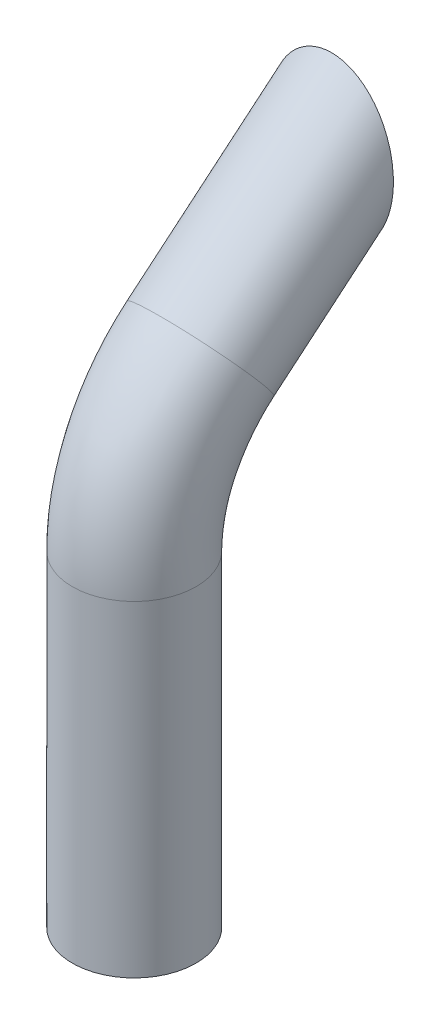
ISO-10303-21;
HEADER;
FILE_DESCRIPTION(('STEP AP214'),'2;1');
FILE_NAME('part.step','',(''),(''),'','','');
FILE_SCHEMA(('AUTOMOTIVE_DESIGN { 1 0 10303 214 1 1 1 1 }'));
ENDSEC;
DATA;
#1=APPLICATION_CONTEXT('core data for automotive mechanical design processes');
#2=APPLICATION_PROTOCOL_DEFINITION('international standard','automotive_design',2000,#1);
#3=PRODUCT_CONTEXT('',#1,'mechanical');
#4=PRODUCT('Part','Part','',(#3));
#5=PRODUCT_RELATED_PRODUCT_CATEGORY('part','',(#4));
#6=PRODUCT_DEFINITION_FORMATION('','',#4);
#7=PRODUCT_DEFINITION_CONTEXT('part definition',#1,'design');
#8=PRODUCT_DEFINITION('design','',#6,#7);
#9=PRODUCT_DEFINITION_SHAPE('','',#8);
#10=(LENGTH_UNIT() NAMED_UNIT(*) SI_UNIT(.MILLI.,.METRE.));
#11=(NAMED_UNIT(*) PLANE_ANGLE_UNIT() SI_UNIT($,.RADIAN.));
#12=(NAMED_UNIT(*) SI_UNIT($,.STERADIAN.) SOLID_ANGLE_UNIT());
#13=UNCERTAINTY_MEASURE_WITH_UNIT(LENGTH_MEASURE(1.E-05),#10,'distance_accuracy_value','');
#14=(GEOMETRIC_REPRESENTATION_CONTEXT(3) GLOBAL_UNCERTAINTY_ASSIGNED_CONTEXT((#13)) GLOBAL_UNIT_ASSIGNED_CONTEXT((#10,
#11,#12)) REPRESENTATION_CONTEXT('',''));
#15=CARTESIAN_POINT('',(0.,0.,0.));
#16=DIRECTION('',(0.,0.,1.));
#17=DIRECTION('',(1.,0.,0.));
#18=AXIS2_PLACEMENT_3D('',#15,#16,#17);
#19=CARTESIAN_POINT('',(0.,-296.418141452981,114.906666467847));
#20=DIRECTION('',(0.,-1.,0.));
#21=DIRECTION('',(0.,0.,-1.));
#22=AXIS2_PLACEMENT_3D('',#19,#20,#21);
#23=PLANE('',#22);
#24=CARTESIAN_POINT('',(0.,-296.418141452981,114.906666467847));
#25=DIRECTION('',(0.,-1.,0.));
#26=DIRECTION('',(0.,0.,-1.));
#27=AXIS2_PLACEMENT_3D('',#24,#25,#26);
#28=CIRCLE('',#27,27.);
#29=CARTESIAN_POINT('',(0.,-296.418141452981,87.9066664678469));
#30=VERTEX_POINT('',#29);
#31=EDGE_CURVE('E56',#30,#30,#28,.T.);
#32=ORIENTED_EDGE('',*,*,#31,.F.);
#33=EDGE_LOOP('',(#32));
#34=FACE_BOUND('',#33,.T.);
#35=CARTESIAN_POINT('',(0.,-296.418141452981,114.906666467847));
#36=DIRECTION('',(0.,-1.,0.));
#37=DIRECTION('',(0.,0.,-1.));
#38=AXIS2_PLACEMENT_3D('',#35,#36,#37);
#39=CIRCLE('',#38,30.);
#40=CARTESIAN_POINT('',(0.,-296.418141452981,84.9066664678469));
#41=VERTEX_POINT('',#40);
#42=EDGE_CURVE('E10',#41,#41,#39,.T.);
#43=ORIENTED_EDGE('',*,*,#42,.T.);
#44=EDGE_LOOP('',(#43));
#45=FACE_BOUND('',#44,.T.);
#46=ADVANCED_FACE('F37',(#34,#45),#23,.T.);
#47=CARTESIAN_POINT('',(0.,0.,0.));
#48=DIRECTION('',(0.,-0.642787609686538,0.766044443118979));
#49=DIRECTION('',(0.,-0.766044443118979,-0.642787609686538));
#50=AXIS2_PLACEMENT_3D('',#47,#48,#49);
#51=CYLINDRICAL_SURFACE('',#50,30.);
#52=CARTESIAN_POINT('',(0.,-16.1808853863989,19.2836282905961));
#53=DIRECTION('',(0.,0.,1.));
#54=DIRECTION('',(0.,-1.,0.));
#55=AXIS2_PLACEMENT_3D('',#52,#53,#54);
#56=ELLIPSE('',#55,39.1622186799683,30.);
#57=CARTESIAN_POINT('',(0.,-55.3431040663672,19.2836282905961));
#58=VERTEX_POINT('',#57);
#59=EDGE_CURVE('E68',#58,#58,#56,.F.);
#60=ORIENTED_EDGE('',*,*,#59,.F.);
#61=EDGE_LOOP('',(#60));
#62=FACE_BOUND('',#61,.T.);
#63=CARTESIAN_POINT('',(0.,-69.4418308062223,82.757551339635));
#64=DIRECTION('',(0.,-0.642787609686538,0.766044443118979));
#65=DIRECTION('',(0.,-0.766044443118979,-0.642787609686538));
#66=AXIS2_PLACEMENT_3D('',#63,#64,#65);
#67=CIRCLE('',#66,30.);
#68=CARTESIAN_POINT('',(0.,-46.4604975126529,102.041179630231));
#69=VERTEX_POINT('',#68);
#70=EDGE_CURVE('E50',#69,#69,#67,.T.);
#71=ORIENTED_EDGE('',*,*,#70,.F.);
#72=EDGE_LOOP('',(#71));
#73=FACE_BOUND('',#72,.T.);
#74=ADVANCED_FACE('F99',(#62,#73),#51,.T.);
#75=CARTESIAN_POINT('',(0.,-138.385830686931,24.9066664678469));
#76=DIRECTION('',(1.,0.,0.));
#77=DIRECTION('',(0.,0.,-1.));
#78=AXIS2_PLACEMENT_3D('',#75,#76,#77);
#79=TOROIDAL_SURFACE('',#78,90.,30.);
#80=CARTESIAN_POINT('',(0.,-138.385830686931,114.906666467847));
#81=DIRECTION('',(0.,-1.,0.));
#82=DIRECTION('',(0.,0.,-1.));
#83=AXIS2_PLACEMENT_3D('',#80,#81,#82);
#84=CIRCLE('',#83,30.);
#85=CARTESIAN_POINT('',(0.,-138.385830686931,144.906666467847));
#86=VERTEX_POINT('',#85);
#87=EDGE_CURVE('E45',#86,#86,#84,.T.);
#88=CARTESIAN_POINT('',(0.,-138.385830686931,24.9066664678469));
#89=DIRECTION('',(1.,0.,0.));
#90=DIRECTION('',(0.,0.,-1.));
#91=AXIS2_PLACEMENT_3D('',#88,#89,#90);
#92=CIRCLE('',#91,120.);
#93=EDGE_CURVE('',#69,#86,#92,.T.);
#94=ORIENTED_EDGE('',*,*,#70,.T.);
#95=ORIENTED_EDGE('',*,*,#87,.F.);
#96=ORIENTED_EDGE('',*,*,#93,.T.);
#97=ORIENTED_EDGE('',*,*,#93,.F.);
#98=EDGE_LOOP('',(#94,#96,#95,#97));
#99=FACE_BOUND('',#98,.T.);
#100=ADVANCED_FACE('F94',(#99),#79,.T.);
#101=CARTESIAN_POINT('',(0.,-138.385830686931,114.906666467847));
#102=DIRECTION('',(0.,-1.,0.));
#103=DIRECTION('',(0.,0.,-1.));
#104=AXIS2_PLACEMENT_3D('',#101,#102,#103);
#105=CYLINDRICAL_SURFACE('',#104,30.);
#106=ORIENTED_EDGE('',*,*,#42,.F.);
#107=EDGE_LOOP('',(#106));
#108=FACE_BOUND('',#107,.T.);
#109=ORIENTED_EDGE('',*,*,#87,.T.);
#110=EDGE_LOOP('',(#109));
#111=FACE_BOUND('',#110,.T.);
#112=ADVANCED_FACE('F92',(#108,#111),#105,.T.);
#113=CARTESIAN_POINT('',(0.,0.,0.));
#114=DIRECTION('',(0.,-0.642787609686538,0.766044443118979));
#115=DIRECTION('',(0.,-0.766044443118979,-0.642787609686538));
#116=AXIS2_PLACEMENT_3D('',#113,#114,#115);
#117=CYLINDRICAL_SURFACE('',#116,27.);
#118=CARTESIAN_POINT('',(0.,-16.1808853863989,19.2836282905961));
#119=DIRECTION('',(0.,0.,1.));
#120=DIRECTION('',(0.,-1.,0.));
#121=AXIS2_PLACEMENT_3D('',#118,#119,#120);
#122=ELLIPSE('',#121,35.2459968119715,27.);
#123=CARTESIAN_POINT('',(0.,-51.4268821983704,19.2836282905961));
#124=VERTEX_POINT('',#123);
#125=EDGE_CURVE('E40',#124,#124,#122,.F.);
#126=ORIENTED_EDGE('',*,*,#125,.T.);
#127=EDGE_LOOP('',(#126));
#128=FACE_BOUND('',#127,.T.);
#129=CARTESIAN_POINT('',(0.,-69.4418308062224,82.7575513396351));
#130=DIRECTION('',(0.,0.642787609686536,-0.766044443118981));
#131=DIRECTION('',(0.,0.766044443118981,0.642787609686536));
#132=AXIS2_PLACEMENT_3D('',#129,#130,#131);
#133=CIRCLE('',#132,27.);
#134=CARTESIAN_POINT('',(0.,-48.7586308420099,100.112816801172));
#135=VERTEX_POINT('',#134);
#136=EDGE_CURVE('E64',#135,#135,#133,.F.);
#137=ORIENTED_EDGE('',*,*,#136,.T.);
#138=EDGE_LOOP('',(#137));
#139=FACE_BOUND('',#138,.T.);
#140=ADVANCED_FACE('F77',(#128,#139),#117,.F.);
#141=CARTESIAN_POINT('',(0.,-138.385830686931,24.9066664678469));
#142=DIRECTION('',(1.,0.,0.));
#143=DIRECTION('',(0.,0.,-1.));
#144=AXIS2_PLACEMENT_3D('',#141,#142,#143);
#145=TOROIDAL_SURFACE('',#144,90.,27.);
#146=CARTESIAN_POINT('',(0.,-138.385830686931,114.906666467847));
#147=DIRECTION('',(0.,-1.,0.));
#148=DIRECTION('',(0.,0.,-1.));
#149=AXIS2_PLACEMENT_3D('',#146,#147,#148);
#150=CIRCLE('',#149,27.);
#151=CARTESIAN_POINT('',(0.,-138.385830686931,141.906666467847));
#152=VERTEX_POINT('',#151);
#153=EDGE_CURVE('E60',#152,#152,#150,.T.);
#154=CARTESIAN_POINT('',(0.,-138.385830686931,24.9066664678469));
#155=DIRECTION('',(1.,0.,0.));
#156=DIRECTION('',(0.,0.,-1.));
#157=AXIS2_PLACEMENT_3D('',#154,#155,#156);
#158=CIRCLE('',#157,117.);
#159=EDGE_CURVE('',#135,#152,#158,.T.);
#160=ORIENTED_EDGE('',*,*,#136,.F.);
#161=ORIENTED_EDGE('',*,*,#153,.T.);
#162=ORIENTED_EDGE('',*,*,#159,.T.);
#163=ORIENTED_EDGE('',*,*,#159,.F.);
#164=EDGE_LOOP('',(#160,#162,#161,#163));
#165=FACE_BOUND('',#164,.T.);
#166=ADVANCED_FACE('F87',(#165),#145,.F.);
#167=CARTESIAN_POINT('',(0.,-138.385830686931,114.906666467847));
#168=DIRECTION('',(0.,-1.,0.));
#169=DIRECTION('',(0.,0.,-1.));
#170=AXIS2_PLACEMENT_3D('',#167,#168,#169);
#171=CYLINDRICAL_SURFACE('',#170,27.);
#172=ORIENTED_EDGE('',*,*,#31,.T.);
#173=EDGE_LOOP('',(#172));
#174=FACE_BOUND('',#173,.T.);
#175=ORIENTED_EDGE('',*,*,#153,.F.);
#176=EDGE_LOOP('',(#175));
#177=FACE_BOUND('',#176,.T.);
#178=ADVANCED_FACE('F82',(#174,#177),#171,.F.);
#179=CARTESIAN_POINT('',(-129.,22.9813332935694,19.2836282905961));
#180=DIRECTION('',(0.,0.,1.));
#181=DIRECTION('',(1.,0.,0.));
#182=AXIS2_PLACEMENT_3D('',#179,#180,#181);
#183=PLANE('',#182);
#184=ORIENTED_EDGE('',*,*,#59,.T.);
#185=EDGE_LOOP('',(#184));
#186=FACE_BOUND('',#185,.T.);
#187=ORIENTED_EDGE('',*,*,#125,.F.);
#188=EDGE_LOOP('',(#187));
#189=FACE_BOUND('',#188,.T.);
#190=ADVANCED_FACE('F80',(#186,#189),#183,.F.);
#191=CLOSED_SHELL('',(#46,#74,#100,#112,#140,#166,#178,#190));
#192=MANIFOLD_SOLID_BREP('B2',#191);
#193=ADVANCED_BREP_SHAPE_REPRESENTATION('',(#18,#192),#14);
#194=SHAPE_DEFINITION_REPRESENTATION(#9,#193);
ENDSEC;
END-ISO-10303-21;
